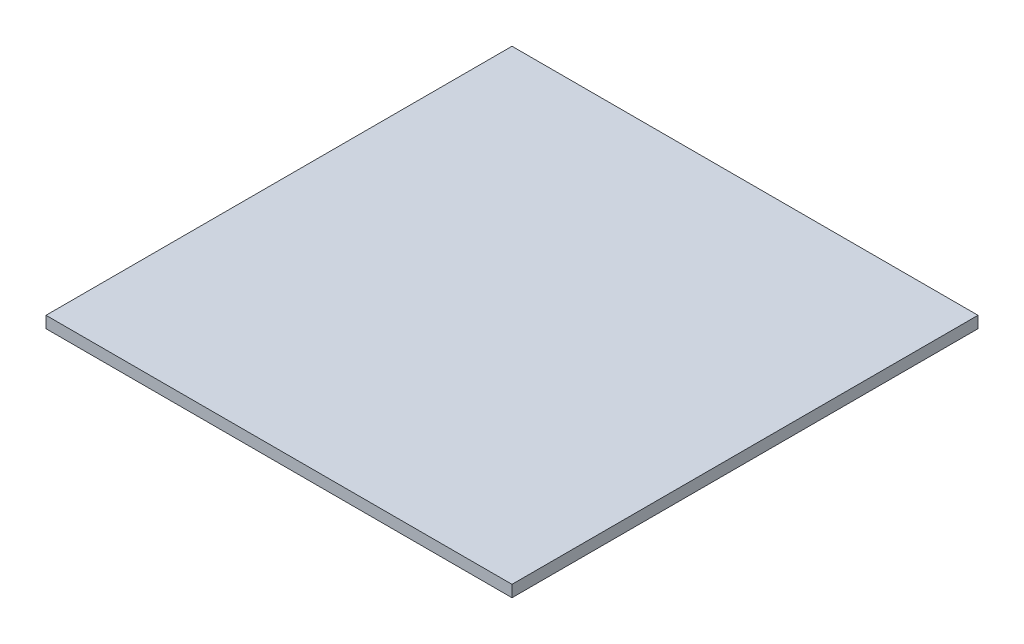
ISO-10303-21;
HEADER;
FILE_DESCRIPTION(('STEP AP214'),'2;1');
FILE_NAME('part.step','',(''),(''),'','','');
FILE_SCHEMA(('AUTOMOTIVE_DESIGN { 1 0 10303 214 1 1 1 1 }'));
ENDSEC;
DATA;
#1=APPLICATION_CONTEXT('core data for automotive mechanical design processes');
#2=APPLICATION_PROTOCOL_DEFINITION('international standard','automotive_design',2000,#1);
#3=PRODUCT_CONTEXT('',#1,'mechanical');
#4=PRODUCT('Part','Part','',(#3));
#5=PRODUCT_RELATED_PRODUCT_CATEGORY('part','',(#4));
#6=PRODUCT_DEFINITION_FORMATION('','',#4);
#7=PRODUCT_DEFINITION_CONTEXT('part definition',#1,'design');
#8=PRODUCT_DEFINITION('design','',#6,#7);
#9=PRODUCT_DEFINITION_SHAPE('','',#8);
#10=(LENGTH_UNIT() NAMED_UNIT(*) SI_UNIT(.MILLI.,.METRE.));
#11=(NAMED_UNIT(*) PLANE_ANGLE_UNIT() SI_UNIT($,.RADIAN.));
#12=(NAMED_UNIT(*) SI_UNIT($,.STERADIAN.) SOLID_ANGLE_UNIT());
#13=UNCERTAINTY_MEASURE_WITH_UNIT(LENGTH_MEASURE(1.E-05),#10,'distance_accuracy_value','');
#14=(GEOMETRIC_REPRESENTATION_CONTEXT(3) GLOBAL_UNCERTAINTY_ASSIGNED_CONTEXT((#13)) GLOBAL_UNIT_ASSIGNED_CONTEXT((#10,
#11,#12)) REPRESENTATION_CONTEXT('',''));
#15=CARTESIAN_POINT('',(0.,0.,0.));
#16=DIRECTION('',(0.,0.,1.));
#17=DIRECTION('',(1.,0.,0.));
#18=AXIS2_PLACEMENT_3D('',#15,#16,#17);
#19=CARTESIAN_POINT('',(4000.,200.,4000.));
#20=DIRECTION('',(-1.,0.,0.));
#21=DIRECTION('',(0.,0.,1.));
#22=AXIS2_PLACEMENT_3D('',#19,#20,#21);
#23=PLANE('',#22);
#24=DIRECTION('',(0.,0.,-1.));
#25=VECTOR('',#24,1.);
#26=CARTESIAN_POINT('',(4000.,0.,4000.));
#27=LINE('',#26,#25);
#28=CARTESIAN_POINT('',(4000.,0.,4000.));
#29=VERTEX_POINT('',#28);
#30=CARTESIAN_POINT('',(4000.,0.,-4000.));
#31=VERTEX_POINT('',#30);
#32=EDGE_CURVE('E102',#29,#31,#27,.T.);
#33=ORIENTED_EDGE('',*,*,#32,.T.);
#34=DIRECTION('',(0.,-1.,0.));
#35=VECTOR('',#34,1.);
#36=CARTESIAN_POINT('',(4000.,200.,-4000.));
#37=LINE('',#36,#35);
#38=CARTESIAN_POINT('',(4000.,200.,-4000.));
#39=VERTEX_POINT('',#38);
#40=EDGE_CURVE('E11',#39,#31,#37,.T.);
#41=ORIENTED_EDGE('',*,*,#40,.F.);
#42=DIRECTION('',(0.,0.,-1.));
#43=VECTOR('',#42,1.);
#44=CARTESIAN_POINT('',(4000.,200.,4000.));
#45=LINE('',#44,#43);
#46=CARTESIAN_POINT('',(4000.,200.,4000.));
#47=VERTEX_POINT('',#46);
#48=EDGE_CURVE('E90',#47,#39,#45,.T.);
#49=ORIENTED_EDGE('',*,*,#48,.F.);
#50=DIRECTION('',(0.,-1.,0.));
#51=VECTOR('',#50,1.);
#52=CARTESIAN_POINT('',(4000.,200.,4000.));
#53=LINE('',#52,#51);
#54=EDGE_CURVE('E98',#47,#29,#53,.T.);
#55=ORIENTED_EDGE('',*,*,#54,.T.);
#56=EDGE_LOOP('',(#33,#41,#49,#55));
#57=FACE_BOUND('',#56,.T.);
#58=ADVANCED_FACE('F39',(#57),#23,.F.);
#59=CARTESIAN_POINT('',(-4000.,200.,-4000.));
#60=DIRECTION('',(0.,0.,1.));
#61=DIRECTION('',(1.,0.,0.));
#62=AXIS2_PLACEMENT_3D('',#59,#60,#61);
#63=PLANE('',#62);
#64=DIRECTION('',(-1.,0.,0.));
#65=VECTOR('',#64,1.);
#66=CARTESIAN_POINT('',(-4000.,0.,-4000.));
#67=LINE('',#66,#65);
#68=CARTESIAN_POINT('',(-4000.,0.,-4000.));
#69=VERTEX_POINT('',#68);
#70=EDGE_CURVE('E94',#31,#69,#67,.T.);
#71=ORIENTED_EDGE('',*,*,#70,.T.);
#72=DIRECTION('',(0.,-1.,0.));
#73=VECTOR('',#72,1.);
#74=CARTESIAN_POINT('',(-4000.,200.,-4000.));
#75=LINE('',#74,#73);
#76=CARTESIAN_POINT('',(-4000.,200.,-4000.));
#77=VERTEX_POINT('',#76);
#78=EDGE_CURVE('E47',#77,#69,#75,.T.);
#79=ORIENTED_EDGE('',*,*,#78,.F.);
#80=DIRECTION('',(-1.,0.,0.));
#81=VECTOR('',#80,1.);
#82=CARTESIAN_POINT('',(-4000.,200.,-4000.));
#83=LINE('',#82,#81);
#84=EDGE_CURVE('E85',#39,#77,#83,.T.);
#85=ORIENTED_EDGE('',*,*,#84,.F.);
#86=ORIENTED_EDGE('',*,*,#40,.T.);
#87=EDGE_LOOP('',(#71,#79,#85,#86));
#88=FACE_BOUND('',#87,.T.);
#89=ADVANCED_FACE('F93',(#88),#63,.F.);
#90=CARTESIAN_POINT('',(-4000.,200.,4000.));
#91=DIRECTION('',(1.,0.,0.));
#92=DIRECTION('',(0.,0.,-1.));
#93=AXIS2_PLACEMENT_3D('',#90,#91,#92);
#94=PLANE('',#93);
#95=DIRECTION('',(0.,0.,1.));
#96=VECTOR('',#95,1.);
#97=CARTESIAN_POINT('',(-4000.,0.,4000.));
#98=LINE('',#97,#96);
#99=CARTESIAN_POINT('',(-4000.,0.,4000.));
#100=VERTEX_POINT('',#99);
#101=EDGE_CURVE('E72',#69,#100,#98,.T.);
#102=ORIENTED_EDGE('',*,*,#101,.T.);
#103=DIRECTION('',(0.,-1.,0.));
#104=VECTOR('',#103,1.);
#105=CARTESIAN_POINT('',(-4000.,200.,4000.));
#106=LINE('',#105,#104);
#107=CARTESIAN_POINT('',(-4000.,200.,4000.));
#108=VERTEX_POINT('',#107);
#109=EDGE_CURVE('E95',#108,#100,#106,.T.);
#110=ORIENTED_EDGE('',*,*,#109,.F.);
#111=DIRECTION('',(0.,0.,1.));
#112=VECTOR('',#111,1.);
#113=CARTESIAN_POINT('',(-4000.,200.,4000.));
#114=LINE('',#113,#112);
#115=EDGE_CURVE('E88',#77,#108,#114,.T.);
#116=ORIENTED_EDGE('',*,*,#115,.F.);
#117=ORIENTED_EDGE('',*,*,#78,.T.);
#118=EDGE_LOOP('',(#102,#110,#116,#117));
#119=FACE_BOUND('',#118,.T.);
#120=ADVANCED_FACE('F96',(#119),#94,.F.);
#121=CARTESIAN_POINT('',(-4000.,200.,4000.));
#122=DIRECTION('',(0.,0.,-1.));
#123=DIRECTION('',(-1.,0.,0.));
#124=AXIS2_PLACEMENT_3D('',#121,#122,#123);
#125=PLANE('',#124);
#126=DIRECTION('',(1.,0.,0.));
#127=VECTOR('',#126,1.);
#128=CARTESIAN_POINT('',(-4000.,0.,4000.));
#129=LINE('',#128,#127);
#130=EDGE_CURVE('E78',#100,#29,#129,.T.);
#131=ORIENTED_EDGE('',*,*,#130,.T.);
#132=ORIENTED_EDGE('',*,*,#54,.F.);
#133=DIRECTION('',(1.,0.,0.));
#134=VECTOR('',#133,1.);
#135=CARTESIAN_POINT('',(-4000.,200.,4000.));
#136=LINE('',#135,#134);
#137=EDGE_CURVE('E55',#108,#47,#136,.T.);
#138=ORIENTED_EDGE('',*,*,#137,.F.);
#139=ORIENTED_EDGE('',*,*,#109,.T.);
#140=EDGE_LOOP('',(#131,#132,#138,#139));
#141=FACE_BOUND('',#140,.T.);
#142=ADVANCED_FACE('F109',(#141),#125,.F.);
#143=CARTESIAN_POINT('',(0.,200.,0.));
#144=DIRECTION('',(0.,-1.,0.));
#145=DIRECTION('',(0.,0.,-1.));
#146=AXIS2_PLACEMENT_3D('',#143,#144,#145);
#147=PLANE('',#146);
#148=ORIENTED_EDGE('',*,*,#48,.T.);
#149=ORIENTED_EDGE('',*,*,#84,.T.);
#150=ORIENTED_EDGE('',*,*,#115,.T.);
#151=ORIENTED_EDGE('',*,*,#137,.T.);
#152=EDGE_LOOP('',(#148,#149,#150,#151));
#153=FACE_BOUND('',#152,.T.);
#154=ADVANCED_FACE('F86',(#153),#147,.F.);
#155=CARTESIAN_POINT('',(0.,0.,0.));
#156=DIRECTION('',(0.,-1.,0.));
#157=DIRECTION('',(0.,0.,-1.));
#158=AXIS2_PLACEMENT_3D('',#155,#156,#157);
#159=PLANE('',#158);
#160=ORIENTED_EDGE('',*,*,#32,.F.);
#161=ORIENTED_EDGE('',*,*,#130,.F.);
#162=ORIENTED_EDGE('',*,*,#101,.F.);
#163=ORIENTED_EDGE('',*,*,#70,.F.);
#164=EDGE_LOOP('',(#160,#161,#162,#163));
#165=FACE_BOUND('',#164,.T.);
#166=ADVANCED_FACE('F112',(#165),#159,.T.);
#167=CLOSED_SHELL('',(#58,#89,#120,#142,#154,#166));
#168=MANIFOLD_SOLID_BREP('B2',#167);
#169=ADVANCED_BREP_SHAPE_REPRESENTATION('',(#18,#168),#14);
#170=SHAPE_DEFINITION_REPRESENTATION(#9,#169);
ENDSEC;
END-ISO-10303-21;
